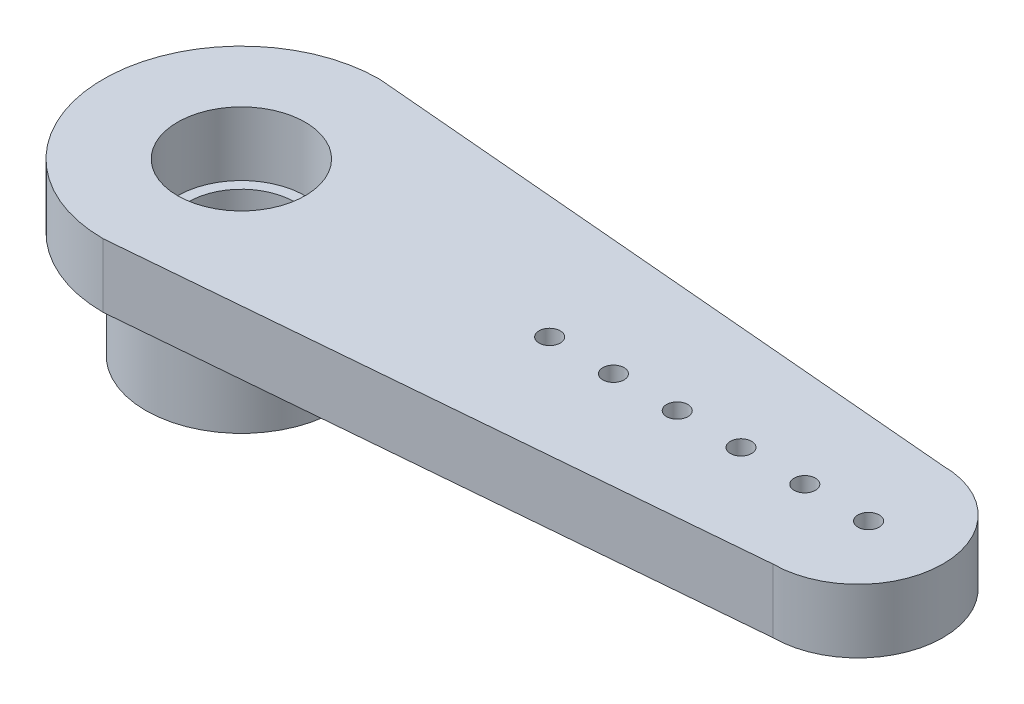
ISO-10303-21;
HEADER;
FILE_DESCRIPTION(('STEP AP214'),'2;1');
FILE_NAME('part.step','',(''),(''),'','','');
FILE_SCHEMA(('AUTOMOTIVE_DESIGN { 1 0 10303 214 1 1 1 1 }'));
ENDSEC;
DATA;
#1=APPLICATION_CONTEXT('core data for automotive mechanical design processes');
#2=APPLICATION_PROTOCOL_DEFINITION('international standard','automotive_design',2000,#1);
#3=PRODUCT_CONTEXT('',#1,'mechanical');
#4=PRODUCT('Part','Part','',(#3));
#5=PRODUCT_RELATED_PRODUCT_CATEGORY('part','',(#4));
#6=PRODUCT_DEFINITION_FORMATION('','',#4);
#7=PRODUCT_DEFINITION_CONTEXT('part definition',#1,'design');
#8=PRODUCT_DEFINITION('design','',#6,#7);
#9=PRODUCT_DEFINITION_SHAPE('','',#8);
#10=(LENGTH_UNIT() NAMED_UNIT(*) SI_UNIT(.MILLI.,.METRE.));
#11=(NAMED_UNIT(*) PLANE_ANGLE_UNIT() SI_UNIT($,.RADIAN.));
#12=(NAMED_UNIT(*) SI_UNIT($,.STERADIAN.) SOLID_ANGLE_UNIT());
#13=UNCERTAINTY_MEASURE_WITH_UNIT(LENGTH_MEASURE(1.E-05),#10,'distance_accuracy_value','');
#14=(GEOMETRIC_REPRESENTATION_CONTEXT(3) GLOBAL_UNCERTAINTY_ASSIGNED_CONTEXT((#13)) GLOBAL_UNIT_ASSIGNED_CONTEXT((#10,
#11,#12)) REPRESENTATION_CONTEXT('',''));
#15=CARTESIAN_POINT('',(0.,0.,0.));
#16=DIRECTION('',(0.,0.,1.));
#17=DIRECTION('',(1.,0.,0.));
#18=AXIS2_PLACEMENT_3D('',#15,#16,#17);
#19=CARTESIAN_POINT('',(0.,3.,0.));
#20=DIRECTION('',(0.,1.,0.));
#21=DIRECTION('',(0.,0.,1.));
#22=AXIS2_PLACEMENT_3D('',#19,#20,#21);
#23=PLANE('',#22);
#24=CARTESIAN_POINT('',(0.,3.,0.));
#25=DIRECTION('',(0.,1.,0.));
#26=DIRECTION('',(0.,0.,1.));
#27=AXIS2_PLACEMENT_3D('',#24,#25,#26);
#28=CIRCLE('',#27,3.);
#29=CARTESIAN_POINT('',(0.,3.,3.));
#30=VERTEX_POINT('',#29);
#31=EDGE_CURVE('E345',#30,#30,#28,.T.);
#32=ORIENTED_EDGE('',*,*,#31,.F.);
#33=EDGE_LOOP('',(#32));
#34=FACE_BOUND('',#33,.T.);
#35=CARTESIAN_POINT('',(26.5,3.,0.));
#36=DIRECTION('',(0.,1.,0.));
#37=DIRECTION('',(0.,0.,1.));
#38=AXIS2_PLACEMENT_3D('',#35,#36,#37);
#39=CIRCLE('',#38,0.499999999999999);
#40=CARTESIAN_POINT('',(26.5,3.,0.499999999999999));
#41=VERTEX_POINT('',#40);
#42=EDGE_CURVE('E149',#41,#41,#39,.T.);
#43=ORIENTED_EDGE('',*,*,#42,.F.);
#44=EDGE_LOOP('',(#43));
#45=FACE_BOUND('',#44,.T.);
#46=CARTESIAN_POINT('',(20.5,3.,0.));
#47=DIRECTION('',(0.,1.,0.));
#48=DIRECTION('',(0.,0.,1.));
#49=AXIS2_PLACEMENT_3D('',#46,#47,#48);
#50=CIRCLE('',#49,0.499999999999999);
#51=CARTESIAN_POINT('',(20.5,3.,0.499999999999999));
#52=VERTEX_POINT('',#51);
#53=EDGE_CURVE('E157',#52,#52,#50,.T.);
#54=ORIENTED_EDGE('',*,*,#53,.F.);
#55=EDGE_LOOP('',(#54));
#56=FACE_BOUND('',#55,.T.);
#57=CARTESIAN_POINT('',(14.5,3.,0.));
#58=DIRECTION('',(0.,1.,0.));
#59=DIRECTION('',(0.,0.,1.));
#60=AXIS2_PLACEMENT_3D('',#57,#58,#59);
#61=CIRCLE('',#60,0.499999999999999);
#62=CARTESIAN_POINT('',(14.5,3.,0.499999999999999));
#63=VERTEX_POINT('',#62);
#64=EDGE_CURVE('E103',#63,#63,#61,.T.);
#65=ORIENTED_EDGE('',*,*,#64,.F.);
#66=EDGE_LOOP('',(#65));
#67=FACE_BOUND('',#66,.T.);
#68=CARTESIAN_POINT('',(0.,3.,0.));
#69=DIRECTION('',(0.,1.,0.));
#70=DIRECTION('',(0.,0.,1.));
#71=AXIS2_PLACEMENT_3D('',#68,#69,#70);
#72=CIRCLE('',#71,6.5);
#73=CARTESIAN_POINT('',(0.,3.,-6.5));
#74=VERTEX_POINT('',#73);
#75=CARTESIAN_POINT('',(0.,3.,6.5));
#76=VERTEX_POINT('',#75);
#77=EDGE_CURVE('E86',#74,#76,#72,.T.);
#78=ORIENTED_EDGE('',*,*,#77,.T.);
#79=DIRECTION('',(0.996304768974939,0.,-0.085888342153012));
#80=VECTOR('',#79,1.);
#81=CARTESIAN_POINT('',(29.,3.,4.));
#82=LINE('',#81,#80);
#83=CARTESIAN_POINT('',(29.,3.,4.));
#84=VERTEX_POINT('',#83);
#85=EDGE_CURVE('E81',#76,#84,#82,.T.);
#86=ORIENTED_EDGE('',*,*,#85,.T.);
#87=CARTESIAN_POINT('',(29.,3.,0.));
#88=DIRECTION('',(0.,1.,0.));
#89=DIRECTION('',(0.,0.,1.));
#90=AXIS2_PLACEMENT_3D('',#87,#88,#89);
#91=CIRCLE('',#90,4.);
#92=CARTESIAN_POINT('',(29.,3.,-4.));
#93=VERTEX_POINT('',#92);
#94=EDGE_CURVE('E84',#84,#93,#91,.T.);
#95=ORIENTED_EDGE('',*,*,#94,.T.);
#96=DIRECTION('',(-0.996304768974939,0.,-0.085888342153012));
#97=VECTOR('',#96,1.);
#98=CARTESIAN_POINT('',(0.,3.,-6.5));
#99=LINE('',#98,#97);
#100=EDGE_CURVE('E50',#93,#74,#99,.T.);
#101=ORIENTED_EDGE('',*,*,#100,.T.);
#102=EDGE_LOOP('',(#78,#86,#95,#101));
#103=FACE_BOUND('',#102,.T.);
#104=CARTESIAN_POINT('',(17.5,3.,0.));
#105=DIRECTION('',(0.,1.,0.));
#106=DIRECTION('',(0.,0.,1.));
#107=AXIS2_PLACEMENT_3D('',#104,#105,#106);
#108=CIRCLE('',#107,0.499999999999999);
#109=CARTESIAN_POINT('',(17.5,3.,0.499999999999999));
#110=VERTEX_POINT('',#109);
#111=EDGE_CURVE('E161',#110,#110,#108,.T.);
#112=ORIENTED_EDGE('',*,*,#111,.F.);
#113=EDGE_LOOP('',(#112));
#114=FACE_BOUND('',#113,.T.);
#115=CARTESIAN_POINT('',(23.5,3.,0.));
#116=DIRECTION('',(0.,1.,0.));
#117=DIRECTION('',(0.,0.,1.));
#118=AXIS2_PLACEMENT_3D('',#115,#116,#117);
#119=CIRCLE('',#118,0.499999999999999);
#120=CARTESIAN_POINT('',(23.5,3.,0.499999999999999));
#121=VERTEX_POINT('',#120);
#122=EDGE_CURVE('E153',#121,#121,#119,.T.);
#123=ORIENTED_EDGE('',*,*,#122,.F.);
#124=EDGE_LOOP('',(#123));
#125=FACE_BOUND('',#124,.T.);
#126=CARTESIAN_POINT('',(29.5,3.,0.));
#127=DIRECTION('',(0.,1.,0.));
#128=DIRECTION('',(0.,0.,1.));
#129=AXIS2_PLACEMENT_3D('',#126,#127,#128);
#130=CIRCLE('',#129,0.499999999999999);
#131=CARTESIAN_POINT('',(29.5,3.,0.499999999999999));
#132=VERTEX_POINT('',#131);
#133=EDGE_CURVE('E140',#132,#132,#130,.T.);
#134=ORIENTED_EDGE('',*,*,#133,.F.);
#135=EDGE_LOOP('',(#134));
#136=FACE_BOUND('',#135,.T.);
#137=ADVANCED_FACE('F33',(#34,#45,#56,#67,#103,#114,#125,#136),#23,.T.);
#138=CARTESIAN_POINT('',(0.,0.,0.));
#139=DIRECTION('',(0.,1.,0.));
#140=DIRECTION('',(0.,0.,1.));
#141=AXIS2_PLACEMENT_3D('',#138,#139,#140);
#142=PLANE('',#141);
#143=CARTESIAN_POINT('',(0.,0.,0.));
#144=DIRECTION('',(0.,1.,0.));
#145=DIRECTION('',(0.,0.,1.));
#146=AXIS2_PLACEMENT_3D('',#143,#144,#145);
#147=CIRCLE('',#146,4.5);
#148=CARTESIAN_POINT('',(0.,0.,4.5));
#149=VERTEX_POINT('',#148);
#150=EDGE_CURVE('E11',#149,#149,#147,.F.);
#151=ORIENTED_EDGE('',*,*,#150,.F.);
#152=EDGE_LOOP('',(#151));
#153=FACE_BOUND('',#152,.T.);
#154=CARTESIAN_POINT('',(0.,0.,0.));
#155=DIRECTION('',(0.,1.,0.));
#156=DIRECTION('',(0.,0.,1.));
#157=AXIS2_PLACEMENT_3D('',#154,#155,#156);
#158=CIRCLE('',#157,6.5);
#159=CARTESIAN_POINT('',(0.,0.,-6.5));
#160=VERTEX_POINT('',#159);
#161=CARTESIAN_POINT('',(0.,0.,6.5));
#162=VERTEX_POINT('',#161);
#163=EDGE_CURVE('E100',#160,#162,#158,.T.);
#164=ORIENTED_EDGE('',*,*,#163,.F.);
#165=DIRECTION('',(-0.996304768974939,0.,-0.085888342153012));
#166=VECTOR('',#165,1.);
#167=CARTESIAN_POINT('',(0.,0.,-6.5));
#168=LINE('',#167,#166);
#169=CARTESIAN_POINT('',(29.,0.,-4.));
#170=VERTEX_POINT('',#169);
#171=EDGE_CURVE('E73',#170,#160,#168,.T.);
#172=ORIENTED_EDGE('',*,*,#171,.F.);
#173=CARTESIAN_POINT('',(29.,0.,0.));
#174=DIRECTION('',(0.,1.,0.));
#175=DIRECTION('',(0.,0.,1.));
#176=AXIS2_PLACEMENT_3D('',#173,#174,#175);
#177=CIRCLE('',#176,4.);
#178=CARTESIAN_POINT('',(29.,0.,4.));
#179=VERTEX_POINT('',#178);
#180=EDGE_CURVE('E67',#179,#170,#177,.T.);
#181=ORIENTED_EDGE('',*,*,#180,.F.);
#182=DIRECTION('',(0.996304768974939,0.,-0.085888342153012));
#183=VECTOR('',#182,1.);
#184=CARTESIAN_POINT('',(29.,0.,4.));
#185=LINE('',#184,#183);
#186=EDGE_CURVE('E91',#162,#179,#185,.T.);
#187=ORIENTED_EDGE('',*,*,#186,.F.);
#188=EDGE_LOOP('',(#164,#172,#181,#187));
#189=FACE_BOUND('',#188,.T.);
#190=CARTESIAN_POINT('',(14.5,0.,0.));
#191=DIRECTION('',(0.,1.,0.));
#192=DIRECTION('',(0.,0.,1.));
#193=AXIS2_PLACEMENT_3D('',#190,#191,#192);
#194=CIRCLE('',#193,0.499999999999999);
#195=CARTESIAN_POINT('',(14.5,0.,0.499999999999999));
#196=VERTEX_POINT('',#195);
#197=EDGE_CURVE('E119',#196,#196,#194,.T.);
#198=ORIENTED_EDGE('',*,*,#197,.T.);
#199=EDGE_LOOP('',(#198));
#200=FACE_BOUND('',#199,.T.);
#201=CARTESIAN_POINT('',(17.5,0.,0.));
#202=DIRECTION('',(0.,1.,0.));
#203=DIRECTION('',(0.,0.,1.));
#204=AXIS2_PLACEMENT_3D('',#201,#202,#203);
#205=CIRCLE('',#204,0.499999999999999);
#206=CARTESIAN_POINT('',(17.5,0.,0.499999999999999));
#207=VERTEX_POINT('',#206);
#208=EDGE_CURVE('E123',#207,#207,#205,.T.);
#209=ORIENTED_EDGE('',*,*,#208,.T.);
#210=EDGE_LOOP('',(#209));
#211=FACE_BOUND('',#210,.T.);
#212=CARTESIAN_POINT('',(20.5,0.,0.));
#213=DIRECTION('',(0.,1.,0.));
#214=DIRECTION('',(0.,0.,1.));
#215=AXIS2_PLACEMENT_3D('',#212,#213,#214);
#216=CIRCLE('',#215,0.499999999999999);
#217=CARTESIAN_POINT('',(20.5,0.,0.499999999999999));
#218=VERTEX_POINT('',#217);
#219=EDGE_CURVE('E127',#218,#218,#216,.T.);
#220=ORIENTED_EDGE('',*,*,#219,.T.);
#221=EDGE_LOOP('',(#220));
#222=FACE_BOUND('',#221,.T.);
#223=CARTESIAN_POINT('',(23.5,0.,0.));
#224=DIRECTION('',(0.,1.,0.));
#225=DIRECTION('',(0.,0.,1.));
#226=AXIS2_PLACEMENT_3D('',#223,#224,#225);
#227=CIRCLE('',#226,0.499999999999999);
#228=CARTESIAN_POINT('',(23.5,0.,0.499999999999999));
#229=VERTEX_POINT('',#228);
#230=EDGE_CURVE('E131',#229,#229,#227,.T.);
#231=ORIENTED_EDGE('',*,*,#230,.T.);
#232=EDGE_LOOP('',(#231));
#233=FACE_BOUND('',#232,.T.);
#234=CARTESIAN_POINT('',(26.5,0.,0.));
#235=DIRECTION('',(0.,1.,0.));
#236=DIRECTION('',(0.,0.,1.));
#237=AXIS2_PLACEMENT_3D('',#234,#235,#236);
#238=CIRCLE('',#237,0.499999999999999);
#239=CARTESIAN_POINT('',(26.5,0.,0.499999999999999));
#240=VERTEX_POINT('',#239);
#241=EDGE_CURVE('E135',#240,#240,#238,.T.);
#242=ORIENTED_EDGE('',*,*,#241,.T.);
#243=EDGE_LOOP('',(#242));
#244=FACE_BOUND('',#243,.T.);
#245=CARTESIAN_POINT('',(29.5,0.,0.));
#246=DIRECTION('',(0.,1.,0.));
#247=DIRECTION('',(0.,0.,1.));
#248=AXIS2_PLACEMENT_3D('',#245,#246,#247);
#249=CIRCLE('',#248,0.499999999999999);
#250=CARTESIAN_POINT('',(29.5,0.,0.499999999999999));
#251=VERTEX_POINT('',#250);
#252=EDGE_CURVE('E138',#251,#251,#249,.T.);
#253=ORIENTED_EDGE('',*,*,#252,.T.);
#254=EDGE_LOOP('',(#253));
#255=FACE_BOUND('',#254,.T.);
#256=ADVANCED_FACE('F111',(#153,#189,#200,#211,#222,#233,#244,#255),#142,.F.);
#257=CARTESIAN_POINT('',(0.,3.,0.));
#258=DIRECTION('',(0.,-1.,0.));
#259=DIRECTION('',(0.,0.,-1.));
#260=AXIS2_PLACEMENT_3D('',#257,#258,#259);
#261=CYLINDRICAL_SURFACE('',#260,6.5);
#262=ORIENTED_EDGE('',*,*,#163,.T.);
#263=DIRECTION('',(0.,-1.,0.));
#264=VECTOR('',#263,1.);
#265=CARTESIAN_POINT('',(0.,3.,6.5));
#266=LINE('',#265,#264);
#267=EDGE_CURVE('E42',#76,#162,#266,.T.);
#268=ORIENTED_EDGE('',*,*,#267,.F.);
#269=ORIENTED_EDGE('',*,*,#77,.F.);
#270=DIRECTION('',(0.,-1.,0.));
#271=VECTOR('',#270,1.);
#272=CARTESIAN_POINT('',(0.,3.,-6.5));
#273=LINE('',#272,#271);
#274=EDGE_CURVE('E96',#74,#160,#273,.T.);
#275=ORIENTED_EDGE('',*,*,#274,.T.);
#276=EDGE_LOOP('',(#262,#268,#269,#275));
#277=FACE_BOUND('',#276,.T.);
#278=ADVANCED_FACE('F35',(#277),#261,.T.);
#279=CARTESIAN_POINT('',(29.,3.,4.));
#280=DIRECTION('',(-0.085888342153012,0.,-0.996304768974939));
#281=DIRECTION('',(-0.996304768974939,0.,0.085888342153012));
#282=AXIS2_PLACEMENT_3D('',#279,#280,#281);
#283=PLANE('',#282);
#284=ORIENTED_EDGE('',*,*,#186,.T.);
#285=DIRECTION('',(0.,-1.,0.));
#286=VECTOR('',#285,1.);
#287=CARTESIAN_POINT('',(29.,3.,4.));
#288=LINE('',#287,#286);
#289=EDGE_CURVE('E89',#84,#179,#288,.T.);
#290=ORIENTED_EDGE('',*,*,#289,.F.);
#291=ORIENTED_EDGE('',*,*,#85,.F.);
#292=ORIENTED_EDGE('',*,*,#267,.T.);
#293=EDGE_LOOP('',(#284,#290,#291,#292));
#294=FACE_BOUND('',#293,.T.);
#295=ADVANCED_FACE('F90',(#294),#283,.F.);
#296=CARTESIAN_POINT('',(29.,3.,0.));
#297=DIRECTION('',(0.,-1.,0.));
#298=DIRECTION('',(0.,0.,-1.));
#299=AXIS2_PLACEMENT_3D('',#296,#297,#298);
#300=CYLINDRICAL_SURFACE('',#299,4.);
#301=ORIENTED_EDGE('',*,*,#180,.T.);
#302=DIRECTION('',(0.,-1.,0.));
#303=VECTOR('',#302,1.);
#304=CARTESIAN_POINT('',(29.,3.,-4.));
#305=LINE('',#304,#303);
#306=EDGE_CURVE('E92',#93,#170,#305,.T.);
#307=ORIENTED_EDGE('',*,*,#306,.F.);
#308=ORIENTED_EDGE('',*,*,#94,.F.);
#309=ORIENTED_EDGE('',*,*,#289,.T.);
#310=EDGE_LOOP('',(#301,#307,#308,#309));
#311=FACE_BOUND('',#310,.T.);
#312=ADVANCED_FACE('F94',(#311),#300,.T.);
#313=CARTESIAN_POINT('',(0.,3.,-6.5));
#314=DIRECTION('',(-0.085888342153012,0.,0.996304768974939));
#315=DIRECTION('',(0.996304768974939,0.,0.085888342153012));
#316=AXIS2_PLACEMENT_3D('',#313,#314,#315);
#317=PLANE('',#316);
#318=ORIENTED_EDGE('',*,*,#171,.T.);
#319=ORIENTED_EDGE('',*,*,#274,.F.);
#320=ORIENTED_EDGE('',*,*,#100,.F.);
#321=ORIENTED_EDGE('',*,*,#306,.T.);
#322=EDGE_LOOP('',(#318,#319,#320,#321));
#323=FACE_BOUND('',#322,.T.);
#324=ADVANCED_FACE('F182',(#323),#317,.F.);
#325=CARTESIAN_POINT('',(14.5,3.,0.));
#326=DIRECTION('',(0.,-1.,0.));
#327=DIRECTION('',(0.,0.,-1.));
#328=AXIS2_PLACEMENT_3D('',#325,#326,#327);
#329=CYLINDRICAL_SURFACE('',#328,0.499999999999999);
#330=ORIENTED_EDGE('',*,*,#64,.T.);
#331=EDGE_LOOP('',(#330));
#332=FACE_BOUND('',#331,.T.);
#333=ORIENTED_EDGE('',*,*,#197,.F.);
#334=EDGE_LOOP('',(#333));
#335=FACE_BOUND('',#334,.T.);
#336=ADVANCED_FACE('F169',(#332,#335),#329,.F.);
#337=CARTESIAN_POINT('',(17.5,3.,0.));
#338=DIRECTION('',(0.,-1.,0.));
#339=DIRECTION('',(0.,0.,-1.));
#340=AXIS2_PLACEMENT_3D('',#337,#338,#339);
#341=CYLINDRICAL_SURFACE('',#340,0.499999999999999);
#342=ORIENTED_EDGE('',*,*,#111,.T.);
#343=EDGE_LOOP('',(#342));
#344=FACE_BOUND('',#343,.T.);
#345=ORIENTED_EDGE('',*,*,#208,.F.);
#346=EDGE_LOOP('',(#345));
#347=FACE_BOUND('',#346,.T.);
#348=ADVANCED_FACE('F275',(#344,#347),#341,.F.);
#349=CARTESIAN_POINT('',(20.5,3.,0.));
#350=DIRECTION('',(0.,-1.,0.));
#351=DIRECTION('',(0.,0.,-1.));
#352=AXIS2_PLACEMENT_3D('',#349,#350,#351);
#353=CYLINDRICAL_SURFACE('',#352,0.499999999999999);
#354=ORIENTED_EDGE('',*,*,#53,.T.);
#355=EDGE_LOOP('',(#354));
#356=FACE_BOUND('',#355,.T.);
#357=ORIENTED_EDGE('',*,*,#219,.F.);
#358=EDGE_LOOP('',(#357));
#359=FACE_BOUND('',#358,.T.);
#360=ADVANCED_FACE('F272',(#356,#359),#353,.F.);
#361=CARTESIAN_POINT('',(23.5,3.,0.));
#362=DIRECTION('',(0.,-1.,0.));
#363=DIRECTION('',(0.,0.,-1.));
#364=AXIS2_PLACEMENT_3D('',#361,#362,#363);
#365=CYLINDRICAL_SURFACE('',#364,0.499999999999999);
#366=ORIENTED_EDGE('',*,*,#122,.T.);
#367=EDGE_LOOP('',(#366));
#368=FACE_BOUND('',#367,.T.);
#369=ORIENTED_EDGE('',*,*,#230,.F.);
#370=EDGE_LOOP('',(#369));
#371=FACE_BOUND('',#370,.T.);
#372=ADVANCED_FACE('F268',(#368,#371),#365,.F.);
#373=CARTESIAN_POINT('',(26.5,3.,0.));
#374=DIRECTION('',(0.,-1.,0.));
#375=DIRECTION('',(0.,0.,-1.));
#376=AXIS2_PLACEMENT_3D('',#373,#374,#375);
#377=CYLINDRICAL_SURFACE('',#376,0.499999999999999);
#378=ORIENTED_EDGE('',*,*,#42,.T.);
#379=EDGE_LOOP('',(#378));
#380=FACE_BOUND('',#379,.T.);
#381=ORIENTED_EDGE('',*,*,#241,.F.);
#382=EDGE_LOOP('',(#381));
#383=FACE_BOUND('',#382,.T.);
#384=ADVANCED_FACE('F264',(#380,#383),#377,.F.);
#385=CARTESIAN_POINT('',(29.5,3.,0.));
#386=DIRECTION('',(0.,-1.,0.));
#387=DIRECTION('',(0.,0.,-1.));
#388=AXIS2_PLACEMENT_3D('',#385,#386,#387);
#389=CYLINDRICAL_SURFACE('',#388,0.499999999999999);
#390=ORIENTED_EDGE('',*,*,#133,.T.);
#391=EDGE_LOOP('',(#390));
#392=FACE_BOUND('',#391,.T.);
#393=ORIENTED_EDGE('',*,*,#252,.F.);
#394=EDGE_LOOP('',(#393));
#395=FACE_BOUND('',#394,.T.);
#396=ADVANCED_FACE('F203',(#392,#395),#389,.F.);
#397=CARTESIAN_POINT('',(0.,-5.,0.));
#398=DIRECTION('',(0.,-1.,0.));
#399=DIRECTION('',(0.,0.,-1.));
#400=AXIS2_PLACEMENT_3D('',#397,#398,#399);
#401=PLANE('',#400);
#402=CARTESIAN_POINT('',(0.,-5.,0.));
#403=DIRECTION('',(0.,-1.,0.));
#404=DIRECTION('',(0.,0.,-1.));
#405=AXIS2_PLACEMENT_3D('',#402,#403,#404);
#406=CIRCLE('',#405,4.5);
#407=CARTESIAN_POINT('',(0.,-5.,-4.5));
#408=VERTEX_POINT('',#407);
#409=EDGE_CURVE('E141',#408,#408,#406,.T.);
#410=ORIENTED_EDGE('',*,*,#409,.T.);
#411=EDGE_LOOP('',(#410));
#412=FACE_BOUND('',#411,.T.);
#413=CARTESIAN_POINT('',(0.,-5.,0.));
#414=DIRECTION('',(0.,-1.,0.));
#415=DIRECTION('',(0.,0.,-1.));
#416=AXIS2_PLACEMENT_3D('',#413,#414,#415);
#417=CIRCLE('',#416,2.5);
#418=CARTESIAN_POINT('',(0.,-5.,-2.5));
#419=VERTEX_POINT('',#418);
#420=EDGE_CURVE('E146',#419,#419,#417,.T.);
#421=ORIENTED_EDGE('',*,*,#420,.F.);
#422=EDGE_LOOP('',(#421));
#423=FACE_BOUND('',#422,.T.);
#424=ADVANCED_FACE('F208',(#412,#423),#401,.T.);
#425=CARTESIAN_POINT('',(0.,-5.,0.));
#426=DIRECTION('',(0.,1.,0.));
#427=DIRECTION('',(0.,0.,1.));
#428=AXIS2_PLACEMENT_3D('',#425,#426,#427);
#429=CYLINDRICAL_SURFACE('',#428,4.5);
#430=ORIENTED_EDGE('',*,*,#409,.F.);
#431=EDGE_LOOP('',(#430));
#432=FACE_BOUND('',#431,.T.);
#433=ORIENTED_EDGE('',*,*,#150,.T.);
#434=EDGE_LOOP('',(#433));
#435=FACE_BOUND('',#434,.T.);
#436=ADVANCED_FACE('F213',(#432,#435),#429,.T.);
#437=CARTESIAN_POINT('',(0.,-5.,0.));
#438=DIRECTION('',(0.,1.,0.));
#439=DIRECTION('',(0.,0.,1.));
#440=AXIS2_PLACEMENT_3D('',#437,#438,#439);
#441=CYLINDRICAL_SURFACE('',#440,2.5);
#442=ORIENTED_EDGE('',*,*,#420,.T.);
#443=EDGE_LOOP('',(#442));
#444=FACE_BOUND('',#443,.T.);
#445=CARTESIAN_POINT('',(0.,0.,0.));
#446=DIRECTION('',(0.,-1.,0.));
#447=DIRECTION('',(0.,0.,-1.));
#448=AXIS2_PLACEMENT_3D('',#445,#446,#447);
#449=CIRCLE('',#448,2.5);
#450=CARTESIAN_POINT('',(0.,0.,-2.5));
#451=VERTEX_POINT('',#450);
#452=EDGE_CURVE('E347',#451,#451,#449,.T.);
#453=ORIENTED_EDGE('',*,*,#452,.F.);
#454=EDGE_LOOP('',(#453));
#455=FACE_BOUND('',#454,.T.);
#456=ADVANCED_FACE('F223',(#444,#455),#441,.F.);
#457=CARTESIAN_POINT('',(0.,0.,0.));
#458=DIRECTION('',(0.,1.,0.));
#459=DIRECTION('',(0.,0.,1.));
#460=AXIS2_PLACEMENT_3D('',#457,#458,#459);
#461=PLANE('',#460);
#462=CARTESIAN_POINT('',(0.,0.,0.));
#463=DIRECTION('',(0.,1.,0.));
#464=DIRECTION('',(0.,0.,1.));
#465=AXIS2_PLACEMENT_3D('',#462,#463,#464);
#466=CIRCLE('',#465,3.);
#467=CARTESIAN_POINT('',(0.,0.,3.));
#468=VERTEX_POINT('',#467);
#469=EDGE_CURVE('E343',#468,#468,#466,.T.);
#470=ORIENTED_EDGE('',*,*,#469,.T.);
#471=EDGE_LOOP('',(#470));
#472=FACE_BOUND('',#471,.T.);
#473=ORIENTED_EDGE('',*,*,#452,.T.);
#474=EDGE_LOOP('',(#473));
#475=FACE_BOUND('',#474,.T.);
#476=ADVANCED_FACE('F232',(#472,#475),#461,.T.);
#477=CARTESIAN_POINT('',(0.,0.,0.));
#478=DIRECTION('',(0.,1.,0.));
#479=DIRECTION('',(0.,0.,1.));
#480=AXIS2_PLACEMENT_3D('',#477,#478,#479);
#481=CYLINDRICAL_SURFACE('',#480,3.);
#482=ORIENTED_EDGE('',*,*,#469,.F.);
#483=EDGE_LOOP('',(#482));
#484=FACE_BOUND('',#483,.T.);
#485=ORIENTED_EDGE('',*,*,#31,.T.);
#486=EDGE_LOOP('',(#485));
#487=FACE_BOUND('',#486,.T.);
#488=ADVANCED_FACE('F246',(#484,#487),#481,.F.);
#489=CLOSED_SHELL('',(#137,#256,#278,#295,#312,#324,#336,#348,#360,#372,#384,#396,#424,#436,
#456,#476,#488));
#490=MANIFOLD_SOLID_BREP('B2',#489);
#491=ADVANCED_BREP_SHAPE_REPRESENTATION('',(#18,#490),#14);
#492=SHAPE_DEFINITION_REPRESENTATION(#9,#491);
ENDSEC;
END-ISO-10303-21;
